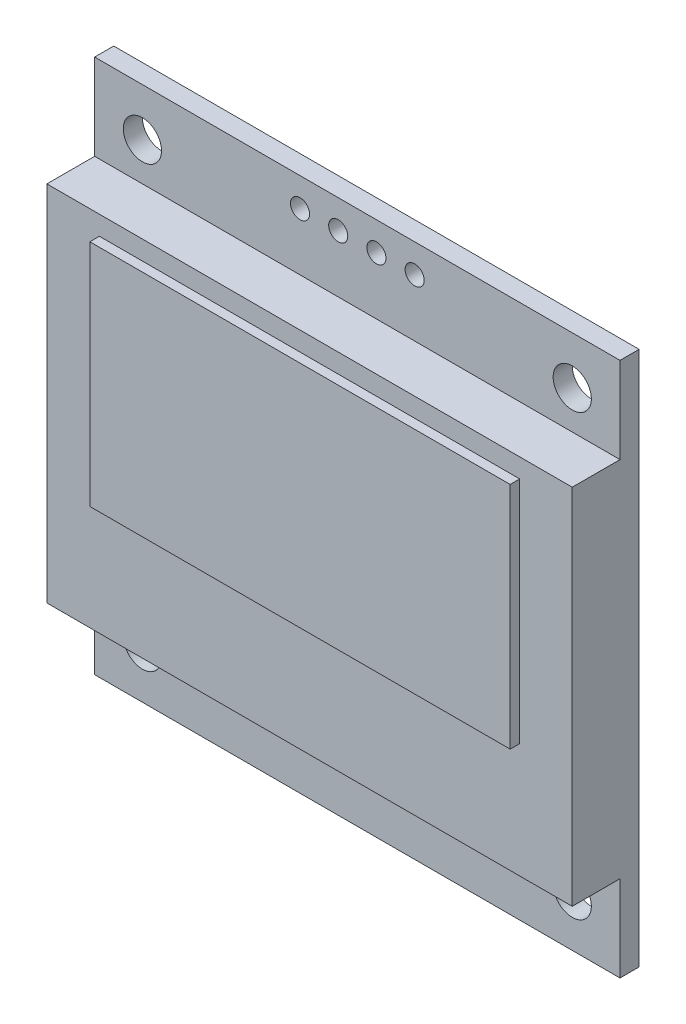
ISO-10303-21;
HEADER;
FILE_DESCRIPTION(('STEP AP214'),'2;1');
FILE_NAME('part.step','',(''),(''),'','','');
FILE_SCHEMA(('AUTOMOTIVE_DESIGN { 1 0 10303 214 1 1 1 1 }'));
ENDSEC;
DATA;
#1=APPLICATION_CONTEXT('core data for automotive mechanical design processes');
#2=APPLICATION_PROTOCOL_DEFINITION('international standard','automotive_design',2000,#1);
#3=PRODUCT_CONTEXT('',#1,'mechanical');
#4=PRODUCT('Part','Part','',(#3));
#5=PRODUCT_RELATED_PRODUCT_CATEGORY('part','',(#4));
#6=PRODUCT_DEFINITION_FORMATION('','',#4);
#7=PRODUCT_DEFINITION_CONTEXT('part definition',#1,'design');
#8=PRODUCT_DEFINITION('design','',#6,#7);
#9=PRODUCT_DEFINITION_SHAPE('','',#8);
#10=(LENGTH_UNIT() NAMED_UNIT(*) SI_UNIT(.MILLI.,.METRE.));
#11=(NAMED_UNIT(*) PLANE_ANGLE_UNIT() SI_UNIT($,.RADIAN.));
#12=(NAMED_UNIT(*) SI_UNIT($,.STERADIAN.) SOLID_ANGLE_UNIT());
#13=UNCERTAINTY_MEASURE_WITH_UNIT(LENGTH_MEASURE(1.E-05),#10,'distance_accuracy_value','');
#14=(GEOMETRIC_REPRESENTATION_CONTEXT(3) GLOBAL_UNCERTAINTY_ASSIGNED_CONTEXT((#13)) GLOBAL_UNIT_ASSIGNED_CONTEXT((#10,
#11,#12)) REPRESENTATION_CONTEXT('',''));
#15=CARTESIAN_POINT('',(0.,0.,0.));
#16=DIRECTION('',(0.,0.,1.));
#17=DIRECTION('',(1.,0.,0.));
#18=AXIS2_PLACEMENT_3D('',#15,#16,#17);
#19=CARTESIAN_POINT('',(0.,-1.05223880597015,3.5));
#20=DIRECTION('',(0.,1.,0.));
#21=DIRECTION('',(0.,0.,1.));
#22=AXIS2_PLACEMENT_3D('',#19,#20,#21);
#23=PLANE('',#22);
#24=DIRECTION('',(1.,0.,0.));
#25=VECTOR('',#24,1.);
#26=CARTESIAN_POINT('',(0.,-1.05223880597015,1.));
#27=LINE('',#26,#25);
#28=CARTESIAN_POINT('',(0.,-1.05223880597015,1.));
#29=VERTEX_POINT('',#28);
#30=CARTESIAN_POINT('',(27.5,-1.05223880597015,1.));
#31=VERTEX_POINT('',#30);
#32=EDGE_CURVE('E60',#29,#31,#27,.T.);
#33=ORIENTED_EDGE('',*,*,#32,.F.);
#34=DIRECTION('',(0.,0.,-1.));
#35=VECTOR('',#34,1.);
#36=CARTESIAN_POINT('',(0.,-1.05223880597015,3.5));
#37=LINE('',#36,#35);
#38=CARTESIAN_POINT('',(0.,-1.05223880597015,3.5));
#39=VERTEX_POINT('',#38);
#40=EDGE_CURVE('E11',#39,#29,#37,.T.);
#41=ORIENTED_EDGE('',*,*,#40,.F.);
#42=DIRECTION('',(1.,0.,0.));
#43=VECTOR('',#42,1.);
#44=CARTESIAN_POINT('',(0.,-1.05223880597015,3.5));
#45=LINE('',#44,#43);
#46=CARTESIAN_POINT('',(27.5,-1.05223880597015,3.5));
#47=VERTEX_POINT('',#46);
#48=EDGE_CURVE('E245',#39,#47,#45,.T.);
#49=ORIENTED_EDGE('',*,*,#48,.T.);
#50=DIRECTION('',(0.,0.,-1.));
#51=VECTOR('',#50,1.);
#52=CARTESIAN_POINT('',(27.5,-1.05223880597015,3.5));
#53=LINE('',#52,#51);
#54=EDGE_CURVE('E265',#47,#31,#53,.T.);
#55=ORIENTED_EDGE('',*,*,#54,.T.);
#56=EDGE_LOOP('',(#33,#41,#49,#55));
#57=FACE_BOUND('',#56,.T.);
#58=ADVANCED_FACE('F38',(#57),#23,.T.);
#59=CARTESIAN_POINT('',(0.,0.,3.5));
#60=DIRECTION('',(1.,0.,0.));
#61=DIRECTION('',(0.,1.,0.));
#62=AXIS2_PLACEMENT_3D('',#59,#60,#61);
#63=PLANE('',#62);
#64=DIRECTION('',(0.,-1.,0.));
#65=VECTOR('',#64,1.);
#66=CARTESIAN_POINT('',(0.,0.,0.));
#67=LINE('',#66,#65);
#68=CARTESIAN_POINT('',(0.,3.44776119402985,0.));
#69=VERTEX_POINT('',#68);
#70=CARTESIAN_POINT('',(0.,-24.5522388059701,0.));
#71=VERTEX_POINT('',#70);
#72=EDGE_CURVE('E244',#69,#71,#67,.T.);
#73=ORIENTED_EDGE('',*,*,#72,.T.);
#74=DIRECTION('',(0.,0.,-1.));
#75=VECTOR('',#74,1.);
#76=CARTESIAN_POINT('',(0.,-24.5522388059701,1.));
#77=LINE('',#76,#75);
#78=CARTESIAN_POINT('',(0.,-24.5522388059701,1.));
#79=VERTEX_POINT('',#78);
#80=EDGE_CURVE('E186',#79,#71,#77,.T.);
#81=ORIENTED_EDGE('',*,*,#80,.F.);
#82=DIRECTION('',(0.,-1.,0.));
#83=VECTOR('',#82,1.);
#84=CARTESIAN_POINT('',(0.,0.,1.));
#85=LINE('',#84,#83);
#86=CARTESIAN_POINT('',(0.,-20.0522388059701,1.));
#87=VERTEX_POINT('',#86);
#88=EDGE_CURVE('E167',#87,#79,#85,.T.);
#89=ORIENTED_EDGE('',*,*,#88,.F.);
#90=DIRECTION('',(0.,0.,-1.));
#91=VECTOR('',#90,1.);
#92=CARTESIAN_POINT('',(0.,-20.0522388059701,3.5));
#93=LINE('',#92,#91);
#94=CARTESIAN_POINT('',(0.,-20.0522388059701,3.5));
#95=VERTEX_POINT('',#94);
#96=EDGE_CURVE('E45',#95,#87,#93,.T.);
#97=ORIENTED_EDGE('',*,*,#96,.F.);
#98=DIRECTION('',(0.,-1.,0.));
#99=VECTOR('',#98,1.);
#100=CARTESIAN_POINT('',(0.,0.,3.5));
#101=LINE('',#100,#99);
#102=EDGE_CURVE('E248',#39,#95,#101,.T.);
#103=ORIENTED_EDGE('',*,*,#102,.F.);
#104=ORIENTED_EDGE('',*,*,#40,.T.);
#105=DIRECTION('',(0.,-1.,0.));
#106=VECTOR('',#105,1.);
#107=CARTESIAN_POINT('',(0.,0.,1.));
#108=LINE('',#107,#106);
#109=CARTESIAN_POINT('',(0.,3.44776119402985,1.));
#110=VERTEX_POINT('',#109);
#111=EDGE_CURVE('E193',#110,#29,#108,.T.);
#112=ORIENTED_EDGE('',*,*,#111,.F.);
#113=DIRECTION('',(0.,0.,-1.));
#114=VECTOR('',#113,1.);
#115=CARTESIAN_POINT('',(0.,3.44776119402985,1.));
#116=LINE('',#115,#114);
#117=EDGE_CURVE('E219',#110,#69,#116,.T.);
#118=ORIENTED_EDGE('',*,*,#117,.T.);
#119=EDGE_LOOP('',(#73,#81,#89,#97,#103,#104,#112,#118));
#120=FACE_BOUND('',#119,.T.);
#121=ADVANCED_FACE('F279',(#120),#63,.F.);
#122=CARTESIAN_POINT('',(0.,-20.0522388059701,3.5));
#123=DIRECTION('',(0.,1.,0.));
#124=DIRECTION('',(0.,0.,1.));
#125=AXIS2_PLACEMENT_3D('',#122,#123,#124);
#126=PLANE('',#125);
#127=ORIENTED_EDGE('',*,*,#96,.T.);
#128=DIRECTION('',(1.,0.,0.));
#129=VECTOR('',#128,1.);
#130=CARTESIAN_POINT('',(0.,-20.0522388059701,1.));
#131=LINE('',#130,#129);
#132=CARTESIAN_POINT('',(27.5,-20.0522388059701,1.));
#133=VERTEX_POINT('',#132);
#134=EDGE_CURVE('E164',#87,#133,#131,.T.);
#135=ORIENTED_EDGE('',*,*,#134,.T.);
#136=DIRECTION('',(0.,0.,-1.));
#137=VECTOR('',#136,1.);
#138=CARTESIAN_POINT('',(27.5,-20.0522388059701,3.5));
#139=LINE('',#138,#137);
#140=CARTESIAN_POINT('',(27.5,-20.0522388059701,3.5));
#141=VERTEX_POINT('',#140);
#142=EDGE_CURVE('E269',#141,#133,#139,.T.);
#143=ORIENTED_EDGE('',*,*,#142,.F.);
#144=DIRECTION('',(1.,0.,0.));
#145=VECTOR('',#144,1.);
#146=CARTESIAN_POINT('',(0.,-20.0522388059701,3.5));
#147=LINE('',#146,#145);
#148=EDGE_CURVE('E251',#95,#141,#147,.T.);
#149=ORIENTED_EDGE('',*,*,#148,.F.);
#150=EDGE_LOOP('',(#127,#135,#143,#149));
#151=FACE_BOUND('',#150,.T.);
#152=ADVANCED_FACE('F275',(#151),#126,.F.);
#153=CARTESIAN_POINT('',(27.5,0.,3.5));
#154=DIRECTION('',(1.,0.,0.));
#155=DIRECTION('',(0.,1.,0.));
#156=AXIS2_PLACEMENT_3D('',#153,#154,#155);
#157=PLANE('',#156);
#158=DIRECTION('',(0.,-1.,0.));
#159=VECTOR('',#158,1.);
#160=CARTESIAN_POINT('',(27.5,0.,0.));
#161=LINE('',#160,#159);
#162=CARTESIAN_POINT('',(27.5,3.44776119402985,0.));
#163=VERTEX_POINT('',#162);
#164=CARTESIAN_POINT('',(27.5,-24.5522388059701,0.));
#165=VERTEX_POINT('',#164);
#166=EDGE_CURVE('E249',#163,#165,#161,.T.);
#167=ORIENTED_EDGE('',*,*,#166,.F.);
#168=DIRECTION('',(0.,0.,-1.));
#169=VECTOR('',#168,1.);
#170=CARTESIAN_POINT('',(27.5,3.44776119402985,1.));
#171=LINE('',#170,#169);
#172=CARTESIAN_POINT('',(27.5,3.44776119402985,1.));
#173=VERTEX_POINT('',#172);
#174=EDGE_CURVE('E241',#173,#163,#171,.T.);
#175=ORIENTED_EDGE('',*,*,#174,.F.);
#176=DIRECTION('',(0.,-1.,0.));
#177=VECTOR('',#176,1.);
#178=CARTESIAN_POINT('',(27.5,0.,1.));
#179=LINE('',#178,#177);
#180=EDGE_CURVE('E198',#173,#31,#179,.T.);
#181=ORIENTED_EDGE('',*,*,#180,.T.);
#182=ORIENTED_EDGE('',*,*,#54,.F.);
#183=DIRECTION('',(0.,-1.,0.));
#184=VECTOR('',#183,1.);
#185=CARTESIAN_POINT('',(27.5,0.,3.5));
#186=LINE('',#185,#184);
#187=EDGE_CURVE('E253',#47,#141,#186,.T.);
#188=ORIENTED_EDGE('',*,*,#187,.T.);
#189=ORIENTED_EDGE('',*,*,#142,.T.);
#190=DIRECTION('',(0.,-1.,0.));
#191=VECTOR('',#190,1.);
#192=CARTESIAN_POINT('',(27.5,0.,1.));
#193=LINE('',#192,#191);
#194=CARTESIAN_POINT('',(27.5,-24.5522388059701,1.));
#195=VERTEX_POINT('',#194);
#196=EDGE_CURVE('E52',#133,#195,#193,.T.);
#197=ORIENTED_EDGE('',*,*,#196,.T.);
#198=DIRECTION('',(0.,0.,-1.));
#199=VECTOR('',#198,1.);
#200=CARTESIAN_POINT('',(27.5,-24.5522388059701,1.));
#201=LINE('',#200,#199);
#202=EDGE_CURVE('E176',#195,#165,#201,.T.);
#203=ORIENTED_EDGE('',*,*,#202,.T.);
#204=EDGE_LOOP('',(#167,#175,#181,#182,#188,#189,#197,#203));
#205=FACE_BOUND('',#204,.T.);
#206=ADVANCED_FACE('F309',(#205),#157,.T.);
#207=CARTESIAN_POINT('',(0.,0.,3.5));
#208=DIRECTION('',(0.,0.,1.));
#209=DIRECTION('',(1.,0.,0.));
#210=AXIS2_PLACEMENT_3D('',#207,#208,#209);
#211=PLANE('',#210);
#212=ORIENTED_EDGE('',*,*,#48,.F.);
#213=ORIENTED_EDGE('',*,*,#102,.T.);
#214=ORIENTED_EDGE('',*,*,#148,.T.);
#215=ORIENTED_EDGE('',*,*,#187,.F.);
#216=EDGE_LOOP('',(#212,#213,#214,#215));
#217=FACE_BOUND('',#216,.T.);
#218=DIRECTION('',(1.,0.,0.));
#219=VECTOR('',#218,1.);
#220=CARTESIAN_POINT('',(0.,-2.05223880597015,3.5));
#221=LINE('',#220,#219);
#222=CARTESIAN_POINT('',(2.75,-2.05223880597015,3.5));
#223=VERTEX_POINT('',#222);
#224=CARTESIAN_POINT('',(24.75,-2.05223880597015,3.5));
#225=VERTEX_POINT('',#224);
#226=EDGE_CURVE('E256',#223,#225,#221,.T.);
#227=ORIENTED_EDGE('',*,*,#226,.T.);
#228=DIRECTION('',(0.,-1.,0.));
#229=VECTOR('',#228,1.);
#230=CARTESIAN_POINT('',(24.75,0.,3.5));
#231=LINE('',#230,#229);
#232=CARTESIAN_POINT('',(24.75,-14.0522388059701,3.5));
#233=VERTEX_POINT('',#232);
#234=EDGE_CURVE('E132',#225,#233,#231,.T.);
#235=ORIENTED_EDGE('',*,*,#234,.T.);
#236=DIRECTION('',(1.,0.,0.));
#237=VECTOR('',#236,1.);
#238=CARTESIAN_POINT('',(0.,-14.0522388059701,3.5));
#239=LINE('',#238,#237);
#240=CARTESIAN_POINT('',(2.75,-14.0522388059701,3.5));
#241=VERTEX_POINT('',#240);
#242=EDGE_CURVE('E259',#241,#233,#239,.T.);
#243=ORIENTED_EDGE('',*,*,#242,.F.);
#244=DIRECTION('',(0.,-1.,0.));
#245=VECTOR('',#244,1.);
#246=CARTESIAN_POINT('',(2.75,0.,3.5));
#247=LINE('',#246,#245);
#248=EDGE_CURVE('E262',#223,#241,#247,.T.);
#249=ORIENTED_EDGE('',*,*,#248,.F.);
#250=EDGE_LOOP('',(#227,#235,#243,#249));
#251=FACE_BOUND('',#250,.T.);
#252=ADVANCED_FACE('F299',(#217,#251),#211,.T.);
#253=CARTESIAN_POINT('',(0.,0.,0.));
#254=DIRECTION('',(0.,0.,1.));
#255=DIRECTION('',(1.,0.,0.));
#256=AXIS2_PLACEMENT_3D('',#253,#254,#255);
#257=PLANE('',#256);
#258=ORIENTED_EDGE('',*,*,#72,.F.);
#259=DIRECTION('',(1.,0.,0.));
#260=VECTOR('',#259,1.);
#261=CARTESIAN_POINT('',(0.,3.44776119402985,0.));
#262=LINE('',#261,#260);
#263=EDGE_CURVE('E222',#69,#163,#262,.T.);
#264=ORIENTED_EDGE('',*,*,#263,.T.);
#265=ORIENTED_EDGE('',*,*,#166,.T.);
#266=DIRECTION('',(1.,0.,0.));
#267=VECTOR('',#266,1.);
#268=CARTESIAN_POINT('',(0.,-24.5522388059701,0.));
#269=LINE('',#268,#267);
#270=EDGE_CURVE('E179',#71,#165,#269,.T.);
#271=ORIENTED_EDGE('',*,*,#270,.F.);
#272=EDGE_LOOP('',(#258,#264,#265,#271));
#273=FACE_BOUND('',#272,.T.);
#274=CARTESIAN_POINT('',(12.75,1.94776119402985,0.));
#275=DIRECTION('',(0.,0.,1.));
#276=DIRECTION('',(1.,0.,0.));
#277=AXIS2_PLACEMENT_3D('',#274,#275,#276);
#278=CIRCLE('',#277,0.499999999999999);
#279=CARTESIAN_POINT('',(13.25,1.94776119402985,0.));
#280=VERTEX_POINT('',#279);
#281=EDGE_CURVE('E189',#280,#280,#278,.F.);
#282=ORIENTED_EDGE('',*,*,#281,.F.);
#283=EDGE_LOOP('',(#282));
#284=FACE_BOUND('',#283,.T.);
#285=CARTESIAN_POINT('',(14.75,1.94776119402985,0.));
#286=DIRECTION('',(0.,0.,1.));
#287=DIRECTION('',(1.,0.,0.));
#288=AXIS2_PLACEMENT_3D('',#285,#286,#287);
#289=CIRCLE('',#288,0.499999999999999);
#290=CARTESIAN_POINT('',(15.25,1.94776119402985,0.));
#291=VERTEX_POINT('',#290);
#292=EDGE_CURVE('E225',#291,#291,#289,.T.);
#293=ORIENTED_EDGE('',*,*,#292,.T.);
#294=EDGE_LOOP('',(#293));
#295=FACE_BOUND('',#294,.T.);
#296=CARTESIAN_POINT('',(16.75,1.94776119402985,0.));
#297=DIRECTION('',(0.,0.,1.));
#298=DIRECTION('',(1.,0.,0.));
#299=AXIS2_PLACEMENT_3D('',#296,#297,#298);
#300=CIRCLE('',#299,0.499999999999999);
#301=CARTESIAN_POINT('',(17.25,1.94776119402985,0.));
#302=VERTEX_POINT('',#301);
#303=EDGE_CURVE('E228',#302,#302,#300,.T.);
#304=ORIENTED_EDGE('',*,*,#303,.T.);
#305=EDGE_LOOP('',(#304));
#306=FACE_BOUND('',#305,.T.);
#307=CARTESIAN_POINT('',(10.75,1.94776119402985,0.));
#308=DIRECTION('',(0.,0.,1.));
#309=DIRECTION('',(1.,0.,0.));
#310=AXIS2_PLACEMENT_3D('',#307,#308,#309);
#311=CIRCLE('',#310,0.499999999999999);
#312=CARTESIAN_POINT('',(11.25,1.94776119402985,0.));
#313=VERTEX_POINT('',#312);
#314=EDGE_CURVE('E231',#313,#313,#311,.F.);
#315=ORIENTED_EDGE('',*,*,#314,.F.);
#316=EDGE_LOOP('',(#315));
#317=FACE_BOUND('',#316,.T.);
#318=CARTESIAN_POINT('',(25.,0.947761194029852,0.));
#319=DIRECTION('',(0.,0.,1.));
#320=DIRECTION('',(1.,0.,0.));
#321=AXIS2_PLACEMENT_3D('',#318,#319,#320);
#322=CIRCLE('',#321,1.);
#323=CARTESIAN_POINT('',(26.,0.947761194029852,0.));
#324=VERTEX_POINT('',#323);
#325=EDGE_CURVE('E234',#324,#324,#322,.T.);
#326=ORIENTED_EDGE('',*,*,#325,.T.);
#327=EDGE_LOOP('',(#326));
#328=FACE_BOUND('',#327,.T.);
#329=CARTESIAN_POINT('',(2.5,0.947761194029852,0.));
#330=DIRECTION('',(0.,0.,1.));
#331=DIRECTION('',(1.,0.,0.));
#332=AXIS2_PLACEMENT_3D('',#329,#330,#331);
#333=CIRCLE('',#332,1.);
#334=CARTESIAN_POINT('',(3.5,0.947761194029852,0.));
#335=VERTEX_POINT('',#334);
#336=EDGE_CURVE('E194',#335,#335,#333,.F.);
#337=ORIENTED_EDGE('',*,*,#336,.F.);
#338=EDGE_LOOP('',(#337));
#339=FACE_BOUND('',#338,.T.);
#340=CARTESIAN_POINT('',(2.5,-22.0522388059701,0.));
#341=DIRECTION('',(0.,0.,1.));
#342=DIRECTION('',(1.,0.,0.));
#343=AXIS2_PLACEMENT_3D('',#340,#341,#342);
#344=CIRCLE('',#343,1.);
#345=CARTESIAN_POINT('',(3.5,-22.0522388059701,0.));
#346=VERTEX_POINT('',#345);
#347=EDGE_CURVE('E136',#346,#346,#344,.T.);
#348=ORIENTED_EDGE('',*,*,#347,.T.);
#349=EDGE_LOOP('',(#348));
#350=FACE_BOUND('',#349,.T.);
#351=CARTESIAN_POINT('',(25.,-22.0522388059701,0.));
#352=DIRECTION('',(0.,0.,1.));
#353=DIRECTION('',(1.,0.,0.));
#354=AXIS2_PLACEMENT_3D('',#351,#352,#353);
#355=CIRCLE('',#354,1.);
#356=CARTESIAN_POINT('',(26.,-22.0522388059701,0.));
#357=VERTEX_POINT('',#356);
#358=EDGE_CURVE('E165',#357,#357,#355,.F.);
#359=ORIENTED_EDGE('',*,*,#358,.F.);
#360=EDGE_LOOP('',(#359));
#361=FACE_BOUND('',#360,.T.);
#362=ADVANCED_FACE('F296',(#273,#284,#295,#306,#317,#328,#339,#350,#361),#257,.F.);
#363=CARTESIAN_POINT('',(25.,0.947761194029852,1.));
#364=DIRECTION('',(0.,0.,-1.));
#365=DIRECTION('',(-1.,0.,0.));
#366=AXIS2_PLACEMENT_3D('',#363,#364,#365);
#367=CYLINDRICAL_SURFACE('',#366,1.);
#368=CARTESIAN_POINT('',(25.,0.947761194029852,1.));
#369=DIRECTION('',(0.,0.,1.));
#370=DIRECTION('',(1.,0.,0.));
#371=AXIS2_PLACEMENT_3D('',#368,#369,#370);
#372=CIRCLE('',#371,1.);
#373=CARTESIAN_POINT('',(26.,0.947761194029852,1.));
#374=VERTEX_POINT('',#373);
#375=EDGE_CURVE('E213',#374,#374,#372,.T.);
#376=ORIENTED_EDGE('',*,*,#375,.T.);
#377=EDGE_LOOP('',(#376));
#378=FACE_BOUND('',#377,.T.);
#379=ORIENTED_EDGE('',*,*,#325,.F.);
#380=EDGE_LOOP('',(#379));
#381=FACE_BOUND('',#380,.T.);
#382=ADVANCED_FACE('F298',(#378,#381),#367,.F.);
#383=CARTESIAN_POINT('',(10.75,1.94776119402985,1.));
#384=DIRECTION('',(0.,0.,-1.));
#385=DIRECTION('',(-1.,0.,0.));
#386=AXIS2_PLACEMENT_3D('',#383,#384,#385);
#387=CYLINDRICAL_SURFACE('',#386,0.499999999999999);
#388=CARTESIAN_POINT('',(10.75,1.94776119402985,1.));
#389=DIRECTION('',(0.,0.,1.));
#390=DIRECTION('',(1.,0.,0.));
#391=AXIS2_PLACEMENT_3D('',#388,#389,#390);
#392=CIRCLE('',#391,0.499999999999999);
#393=CARTESIAN_POINT('',(11.25,1.94776119402985,1.));
#394=VERTEX_POINT('',#393);
#395=EDGE_CURVE('E210',#394,#394,#392,.F.);
#396=ORIENTED_EDGE('',*,*,#395,.F.);
#397=EDGE_LOOP('',(#396));
#398=FACE_BOUND('',#397,.T.);
#399=ORIENTED_EDGE('',*,*,#314,.T.);
#400=EDGE_LOOP('',(#399));
#401=FACE_BOUND('',#400,.T.);
#402=ADVANCED_FACE('F306',(#398,#401),#387,.F.);
#403=CARTESIAN_POINT('',(16.75,1.94776119402985,1.));
#404=DIRECTION('',(0.,0.,-1.));
#405=DIRECTION('',(-1.,0.,0.));
#406=AXIS2_PLACEMENT_3D('',#403,#404,#405);
#407=CYLINDRICAL_SURFACE('',#406,0.499999999999999);
#408=CARTESIAN_POINT('',(16.75,1.94776119402985,1.));
#409=DIRECTION('',(0.,0.,1.));
#410=DIRECTION('',(1.,0.,0.));
#411=AXIS2_PLACEMENT_3D('',#408,#409,#410);
#412=CIRCLE('',#411,0.499999999999999);
#413=CARTESIAN_POINT('',(17.25,1.94776119402985,1.));
#414=VERTEX_POINT('',#413);
#415=EDGE_CURVE('E207',#414,#414,#412,.T.);
#416=ORIENTED_EDGE('',*,*,#415,.T.);
#417=EDGE_LOOP('',(#416));
#418=FACE_BOUND('',#417,.T.);
#419=ORIENTED_EDGE('',*,*,#303,.F.);
#420=EDGE_LOOP('',(#419));
#421=FACE_BOUND('',#420,.T.);
#422=ADVANCED_FACE('F374',(#418,#421),#407,.F.);
#423=CARTESIAN_POINT('',(14.75,1.94776119402985,1.));
#424=DIRECTION('',(0.,0.,-1.));
#425=DIRECTION('',(-1.,0.,0.));
#426=AXIS2_PLACEMENT_3D('',#423,#424,#425);
#427=CYLINDRICAL_SURFACE('',#426,0.499999999999999);
#428=CARTESIAN_POINT('',(14.75,1.94776119402985,1.));
#429=DIRECTION('',(0.,0.,1.));
#430=DIRECTION('',(1.,0.,0.));
#431=AXIS2_PLACEMENT_3D('',#428,#429,#430);
#432=CIRCLE('',#431,0.499999999999999);
#433=CARTESIAN_POINT('',(15.25,1.94776119402985,1.));
#434=VERTEX_POINT('',#433);
#435=EDGE_CURVE('E204',#434,#434,#432,.T.);
#436=ORIENTED_EDGE('',*,*,#435,.T.);
#437=EDGE_LOOP('',(#436));
#438=FACE_BOUND('',#437,.T.);
#439=ORIENTED_EDGE('',*,*,#292,.F.);
#440=EDGE_LOOP('',(#439));
#441=FACE_BOUND('',#440,.T.);
#442=ADVANCED_FACE('F378',(#438,#441),#427,.F.);
#443=CARTESIAN_POINT('',(0.,3.44776119402985,1.));
#444=DIRECTION('',(0.,1.,0.));
#445=DIRECTION('',(0.,0.,1.));
#446=AXIS2_PLACEMENT_3D('',#443,#444,#445);
#447=PLANE('',#446);
#448=ORIENTED_EDGE('',*,*,#263,.F.);
#449=ORIENTED_EDGE('',*,*,#117,.F.);
#450=DIRECTION('',(1.,0.,0.));
#451=VECTOR('',#450,1.);
#452=CARTESIAN_POINT('',(0.,3.44776119402985,1.));
#453=LINE('',#452,#451);
#454=EDGE_CURVE('E201',#110,#173,#453,.T.);
#455=ORIENTED_EDGE('',*,*,#454,.T.);
#456=ORIENTED_EDGE('',*,*,#174,.T.);
#457=EDGE_LOOP('',(#448,#449,#455,#456));
#458=FACE_BOUND('',#457,.T.);
#459=ADVANCED_FACE('F331',(#458),#447,.T.);
#460=CARTESIAN_POINT('',(12.75,1.94776119402985,1.));
#461=DIRECTION('',(0.,0.,-1.));
#462=DIRECTION('',(-1.,0.,0.));
#463=AXIS2_PLACEMENT_3D('',#460,#461,#462);
#464=CYLINDRICAL_SURFACE('',#463,0.499999999999999);
#465=CARTESIAN_POINT('',(12.75,1.94776119402985,1.));
#466=DIRECTION('',(0.,0.,1.));
#467=DIRECTION('',(1.,0.,0.));
#468=AXIS2_PLACEMENT_3D('',#465,#466,#467);
#469=CIRCLE('',#468,0.499999999999999);
#470=CARTESIAN_POINT('',(13.25,1.94776119402985,1.));
#471=VERTEX_POINT('',#470);
#472=EDGE_CURVE('E190',#471,#471,#469,.F.);
#473=ORIENTED_EDGE('',*,*,#472,.F.);
#474=EDGE_LOOP('',(#473));
#475=FACE_BOUND('',#474,.T.);
#476=ORIENTED_EDGE('',*,*,#281,.T.);
#477=EDGE_LOOP('',(#476));
#478=FACE_BOUND('',#477,.T.);
#479=ADVANCED_FACE('F369',(#475,#478),#464,.F.);
#480=CARTESIAN_POINT('',(2.5,0.947761194029852,1.));
#481=DIRECTION('',(0.,0.,-1.));
#482=DIRECTION('',(-1.,0.,0.));
#483=AXIS2_PLACEMENT_3D('',#480,#481,#482);
#484=CYLINDRICAL_SURFACE('',#483,1.);
#485=CARTESIAN_POINT('',(2.5,0.947761194029852,1.));
#486=DIRECTION('',(0.,0.,1.));
#487=DIRECTION('',(1.,0.,0.));
#488=AXIS2_PLACEMENT_3D('',#485,#486,#487);
#489=CIRCLE('',#488,1.);
#490=CARTESIAN_POINT('',(3.5,0.947761194029852,1.));
#491=VERTEX_POINT('',#490);
#492=EDGE_CURVE('E216',#491,#491,#489,.F.);
#493=ORIENTED_EDGE('',*,*,#492,.F.);
#494=EDGE_LOOP('',(#493));
#495=FACE_BOUND('',#494,.T.);
#496=ORIENTED_EDGE('',*,*,#336,.T.);
#497=EDGE_LOOP('',(#496));
#498=FACE_BOUND('',#497,.T.);
#499=ADVANCED_FACE('F366',(#495,#498),#484,.F.);
#500=CARTESIAN_POINT('',(0.,0.,1.));
#501=DIRECTION('',(0.,0.,1.));
#502=DIRECTION('',(1.,0.,0.));
#503=AXIS2_PLACEMENT_3D('',#500,#501,#502);
#504=PLANE('',#503);
#505=ORIENTED_EDGE('',*,*,#472,.T.);
#506=EDGE_LOOP('',(#505));
#507=FACE_BOUND('',#506,.T.);
#508=ORIENTED_EDGE('',*,*,#111,.T.);
#509=ORIENTED_EDGE('',*,*,#32,.T.);
#510=ORIENTED_EDGE('',*,*,#180,.F.);
#511=ORIENTED_EDGE('',*,*,#454,.F.);
#512=EDGE_LOOP('',(#508,#509,#510,#511));
#513=FACE_BOUND('',#512,.T.);
#514=ORIENTED_EDGE('',*,*,#435,.F.);
#515=EDGE_LOOP('',(#514));
#516=FACE_BOUND('',#515,.T.);
#517=ORIENTED_EDGE('',*,*,#415,.F.);
#518=EDGE_LOOP('',(#517));
#519=FACE_BOUND('',#518,.T.);
#520=ORIENTED_EDGE('',*,*,#395,.T.);
#521=EDGE_LOOP('',(#520));
#522=FACE_BOUND('',#521,.T.);
#523=ORIENTED_EDGE('',*,*,#375,.F.);
#524=EDGE_LOOP('',(#523));
#525=FACE_BOUND('',#524,.T.);
#526=ORIENTED_EDGE('',*,*,#492,.T.);
#527=EDGE_LOOP('',(#526));
#528=FACE_BOUND('',#527,.T.);
#529=ADVANCED_FACE('F335',(#507,#513,#516,#519,#522,#525,#528),#504,.T.);
#530=CARTESIAN_POINT('',(0.,-24.5522388059701,1.));
#531=DIRECTION('',(0.,1.,0.));
#532=DIRECTION('',(0.,0.,1.));
#533=AXIS2_PLACEMENT_3D('',#530,#531,#532);
#534=PLANE('',#533);
#535=ORIENTED_EDGE('',*,*,#270,.T.);
#536=ORIENTED_EDGE('',*,*,#202,.F.);
#537=DIRECTION('',(1.,0.,0.));
#538=VECTOR('',#537,1.);
#539=CARTESIAN_POINT('',(0.,-24.5522388059701,1.));
#540=LINE('',#539,#538);
#541=EDGE_CURVE('E170',#79,#195,#540,.T.);
#542=ORIENTED_EDGE('',*,*,#541,.F.);
#543=ORIENTED_EDGE('',*,*,#80,.T.);
#544=EDGE_LOOP('',(#535,#536,#542,#543));
#545=FACE_BOUND('',#544,.T.);
#546=ADVANCED_FACE('F357',(#545),#534,.F.);
#547=CARTESIAN_POINT('',(2.5,-22.0522388059701,1.));
#548=DIRECTION('',(0.,0.,-1.));
#549=DIRECTION('',(-1.,0.,0.));
#550=AXIS2_PLACEMENT_3D('',#547,#548,#549);
#551=CYLINDRICAL_SURFACE('',#550,1.);
#552=CARTESIAN_POINT('',(2.5,-22.0522388059701,1.));
#553=DIRECTION('',(0.,0.,1.));
#554=DIRECTION('',(1.,0.,0.));
#555=AXIS2_PLACEMENT_3D('',#552,#553,#554);
#556=CIRCLE('',#555,1.);
#557=CARTESIAN_POINT('',(3.5,-22.0522388059701,1.));
#558=VERTEX_POINT('',#557);
#559=EDGE_CURVE('E161',#558,#558,#556,.T.);
#560=ORIENTED_EDGE('',*,*,#559,.T.);
#561=EDGE_LOOP('',(#560));
#562=FACE_BOUND('',#561,.T.);
#563=ORIENTED_EDGE('',*,*,#347,.F.);
#564=EDGE_LOOP('',(#563));
#565=FACE_BOUND('',#564,.T.);
#566=ADVANCED_FACE('F292',(#562,#565),#551,.F.);
#567=CARTESIAN_POINT('',(25.,-22.0522388059701,1.));
#568=DIRECTION('',(0.,0.,-1.));
#569=DIRECTION('',(-1.,0.,0.));
#570=AXIS2_PLACEMENT_3D('',#567,#568,#569);
#571=CYLINDRICAL_SURFACE('',#570,1.);
#572=CARTESIAN_POINT('',(25.,-22.0522388059701,1.));
#573=DIRECTION('',(0.,0.,1.));
#574=DIRECTION('',(1.,0.,0.));
#575=AXIS2_PLACEMENT_3D('',#572,#573,#574);
#576=CIRCLE('',#575,1.);
#577=CARTESIAN_POINT('',(26.,-22.0522388059701,1.));
#578=VERTEX_POINT('',#577);
#579=EDGE_CURVE('E173',#578,#578,#576,.F.);
#580=ORIENTED_EDGE('',*,*,#579,.F.);
#581=EDGE_LOOP('',(#580));
#582=FACE_BOUND('',#581,.T.);
#583=ORIENTED_EDGE('',*,*,#358,.T.);
#584=EDGE_LOOP('',(#583));
#585=FACE_BOUND('',#584,.T.);
#586=ADVANCED_FACE('F285',(#582,#585),#571,.F.);
#587=CARTESIAN_POINT('',(0.,0.,1.));
#588=DIRECTION('',(0.,0.,1.));
#589=DIRECTION('',(1.,0.,0.));
#590=AXIS2_PLACEMENT_3D('',#587,#588,#589);
#591=PLANE('',#590);
#592=ORIENTED_EDGE('',*,*,#559,.F.);
#593=EDGE_LOOP('',(#592));
#594=FACE_BOUND('',#593,.T.);
#595=ORIENTED_EDGE('',*,*,#134,.F.);
#596=ORIENTED_EDGE('',*,*,#88,.T.);
#597=ORIENTED_EDGE('',*,*,#541,.T.);
#598=ORIENTED_EDGE('',*,*,#196,.F.);
#599=EDGE_LOOP('',(#595,#596,#597,#598));
#600=FACE_BOUND('',#599,.T.);
#601=ORIENTED_EDGE('',*,*,#579,.T.);
#602=EDGE_LOOP('',(#601));
#603=FACE_BOUND('',#602,.T.);
#604=ADVANCED_FACE('F282',(#594,#600,#603),#591,.T.);
#605=CARTESIAN_POINT('',(24.75,0.,4.));
#606=DIRECTION('',(1.,0.,0.));
#607=DIRECTION('',(0.,0.,-1.));
#608=AXIS2_PLACEMENT_3D('',#605,#606,#607);
#609=PLANE('',#608);
#610=DIRECTION('',(0.,0.,-1.));
#611=VECTOR('',#610,1.);
#612=CARTESIAN_POINT('',(24.75,-14.0522388059701,4.));
#613=LINE('',#612,#611);
#614=CARTESIAN_POINT('',(24.75,-14.0522388059701,4.));
#615=VERTEX_POINT('',#614);
#616=EDGE_CURVE('E155',#615,#233,#613,.T.);
#617=ORIENTED_EDGE('',*,*,#616,.T.);
#618=ORIENTED_EDGE('',*,*,#234,.F.);
#619=DIRECTION('',(0.,0.,-1.));
#620=VECTOR('',#619,1.);
#621=CARTESIAN_POINT('',(24.75,-2.05223880597015,4.));
#622=LINE('',#621,#620);
#623=CARTESIAN_POINT('',(24.75,-2.05223880597015,4.));
#624=VERTEX_POINT('',#623);
#625=EDGE_CURVE('E127',#624,#225,#622,.T.);
#626=ORIENTED_EDGE('',*,*,#625,.F.);
#627=DIRECTION('',(0.,-1.,0.));
#628=VECTOR('',#627,1.);
#629=CARTESIAN_POINT('',(24.75,0.,4.));
#630=LINE('',#629,#628);
#631=EDGE_CURVE('E131',#624,#615,#630,.T.);
#632=ORIENTED_EDGE('',*,*,#631,.T.);
#633=EDGE_LOOP('',(#617,#618,#626,#632));
#634=FACE_BOUND('',#633,.T.);
#635=ADVANCED_FACE('F130',(#634),#609,.T.);
#636=CARTESIAN_POINT('',(0.,-2.05223880597015,4.));
#637=DIRECTION('',(0.,1.,0.));
#638=DIRECTION('',(0.,0.,1.));
#639=AXIS2_PLACEMENT_3D('',#636,#637,#638);
#640=PLANE('',#639);
#641=ORIENTED_EDGE('',*,*,#625,.T.);
#642=ORIENTED_EDGE('',*,*,#226,.F.);
#643=DIRECTION('',(0.,0.,-1.));
#644=VECTOR('',#643,1.);
#645=CARTESIAN_POINT('',(2.75,-2.05223880597015,4.));
#646=LINE('',#645,#644);
#647=CARTESIAN_POINT('',(2.75,-2.05223880597015,4.));
#648=VERTEX_POINT('',#647);
#649=EDGE_CURVE('E137',#648,#223,#646,.T.);
#650=ORIENTED_EDGE('',*,*,#649,.F.);
#651=DIRECTION('',(1.,0.,0.));
#652=VECTOR('',#651,1.);
#653=CARTESIAN_POINT('',(0.,-2.05223880597015,4.));
#654=LINE('',#653,#652);
#655=EDGE_CURVE('E142',#648,#624,#654,.T.);
#656=ORIENTED_EDGE('',*,*,#655,.T.);
#657=EDGE_LOOP('',(#641,#642,#650,#656));
#658=FACE_BOUND('',#657,.T.);
#659=ADVANCED_FACE('F147',(#658),#640,.T.);
#660=CARTESIAN_POINT('',(2.75,0.,4.));
#661=DIRECTION('',(1.,0.,0.));
#662=DIRECTION('',(0.,1.,0.));
#663=AXIS2_PLACEMENT_3D('',#660,#661,#662);
#664=PLANE('',#663);
#665=ORIENTED_EDGE('',*,*,#248,.T.);
#666=DIRECTION('',(0.,0.,-1.));
#667=VECTOR('',#666,1.);
#668=CARTESIAN_POINT('',(2.75,-14.0522388059701,4.));
#669=LINE('',#668,#667);
#670=CARTESIAN_POINT('',(2.75,-14.0522388059701,4.));
#671=VERTEX_POINT('',#670);
#672=EDGE_CURVE('E157',#671,#241,#669,.T.);
#673=ORIENTED_EDGE('',*,*,#672,.F.);
#674=DIRECTION('',(0.,-1.,0.));
#675=VECTOR('',#674,1.);
#676=CARTESIAN_POINT('',(2.75,0.,4.));
#677=LINE('',#676,#675);
#678=EDGE_CURVE('E150',#648,#671,#677,.T.);
#679=ORIENTED_EDGE('',*,*,#678,.F.);
#680=ORIENTED_EDGE('',*,*,#649,.T.);
#681=EDGE_LOOP('',(#665,#673,#679,#680));
#682=FACE_BOUND('',#681,.T.);
#683=ADVANCED_FACE('F340',(#682),#664,.F.);
#684=CARTESIAN_POINT('',(0.,-14.0522388059701,4.));
#685=DIRECTION('',(0.,1.,0.));
#686=DIRECTION('',(0.,0.,1.));
#687=AXIS2_PLACEMENT_3D('',#684,#685,#686);
#688=PLANE('',#687);
#689=ORIENTED_EDGE('',*,*,#242,.T.);
#690=ORIENTED_EDGE('',*,*,#616,.F.);
#691=DIRECTION('',(1.,0.,0.));
#692=VECTOR('',#691,1.);
#693=CARTESIAN_POINT('',(0.,-14.0522388059701,4.));
#694=LINE('',#693,#692);
#695=EDGE_CURVE('E144',#671,#615,#694,.T.);
#696=ORIENTED_EDGE('',*,*,#695,.F.);
#697=ORIENTED_EDGE('',*,*,#672,.T.);
#698=EDGE_LOOP('',(#689,#690,#696,#697));
#699=FACE_BOUND('',#698,.T.);
#700=ADVANCED_FACE('F343',(#699),#688,.F.);
#701=CARTESIAN_POINT('',(0.,0.,4.));
#702=DIRECTION('',(0.,0.,1.));
#703=DIRECTION('',(1.,0.,0.));
#704=AXIS2_PLACEMENT_3D('',#701,#702,#703);
#705=PLANE('',#704);
#706=ORIENTED_EDGE('',*,*,#631,.F.);
#707=ORIENTED_EDGE('',*,*,#655,.F.);
#708=ORIENTED_EDGE('',*,*,#678,.T.);
#709=ORIENTED_EDGE('',*,*,#695,.T.);
#710=EDGE_LOOP('',(#706,#707,#708,#709));
#711=FACE_BOUND('',#710,.T.);
#712=ADVANCED_FACE('F141',(#711),#705,.T.);
#713=CLOSED_SHELL('',(#58,#121,#152,#206,#252,#362,#382,#402,#422,#442,#459,#479,#499,#529,#546,
#566,#586,#604,#635,#659,#683,#700,#712));
#714=MANIFOLD_SOLID_BREP('B2',#713);
#715=ADVANCED_BREP_SHAPE_REPRESENTATION('',(#18,#714),#14);
#716=SHAPE_DEFINITION_REPRESENTATION(#9,#715);
ENDSEC;
END-ISO-10303-21;
